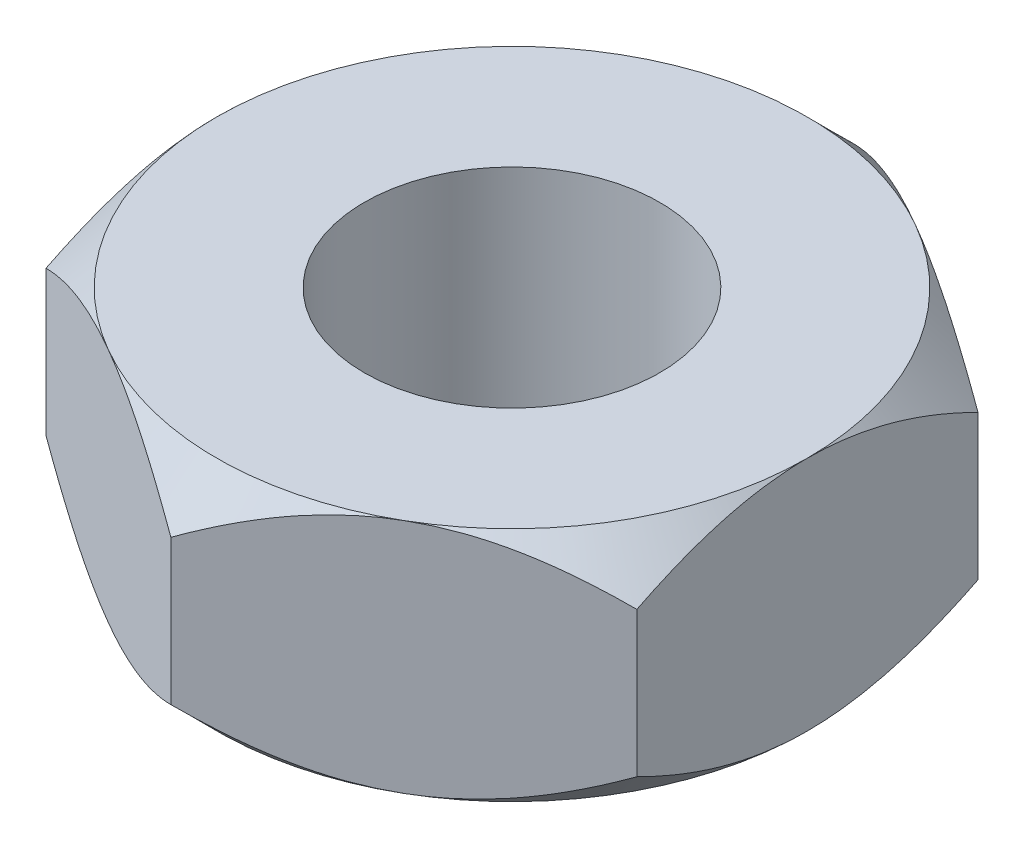
ISO-10303-21;
HEADER;
FILE_DESCRIPTION(('STEP AP214'),'2;1');
FILE_NAME('part.step','',(''),(''),'','','');
FILE_SCHEMA(('AUTOMOTIVE_DESIGN { 1 0 10303 214 1 1 1 1 }'));
ENDSEC;
DATA;
#1=APPLICATION_CONTEXT('core data for automotive mechanical design processes');
#2=APPLICATION_PROTOCOL_DEFINITION('international standard','automotive_design',2000,#1);
#3=PRODUCT_CONTEXT('',#1,'mechanical');
#4=PRODUCT('Part','Part','',(#3));
#5=PRODUCT_RELATED_PRODUCT_CATEGORY('part','',(#4));
#6=PRODUCT_DEFINITION_FORMATION('','',#4);
#7=PRODUCT_DEFINITION_CONTEXT('part definition',#1,'design');
#8=PRODUCT_DEFINITION('design','',#6,#7);
#9=PRODUCT_DEFINITION_SHAPE('','',#8);
#10=(LENGTH_UNIT() NAMED_UNIT(*) SI_UNIT(.MILLI.,.METRE.));
#11=(NAMED_UNIT(*) PLANE_ANGLE_UNIT() SI_UNIT($,.RADIAN.));
#12=(NAMED_UNIT(*) SI_UNIT($,.STERADIAN.) SOLID_ANGLE_UNIT());
#13=UNCERTAINTY_MEASURE_WITH_UNIT(LENGTH_MEASURE(1.E-05),#10,'distance_accuracy_value','');
#14=(GEOMETRIC_REPRESENTATION_CONTEXT(3) GLOBAL_UNCERTAINTY_ASSIGNED_CONTEXT((#13)) GLOBAL_UNIT_ASSIGNED_CONTEXT((#10,
#11,#12)) REPRESENTATION_CONTEXT('',''));
#15=CARTESIAN_POINT('',(0.,0.,0.));
#16=DIRECTION('',(0.,0.,1.));
#17=DIRECTION('',(1.,0.,0.));
#18=AXIS2_PLACEMENT_3D('',#15,#16,#17);
#19=CARTESIAN_POINT('',(2.5,2.,-1.44337567297407));
#20=DIRECTION('',(-0.5,0.,0.866025403784439));
#21=DIRECTION('',(0.866025403784439,0.,0.5));
#22=AXIS2_PLACEMENT_3D('',#19,#20,#21);
#23=PLANE('',#22);
#24=CARTESIAN_POINT('',(-0.000199999999999338,0.386866822929892,-2.88686681600197));
#25=CARTESIAN_POINT('',(0.0857382777877658,0.337292051302855,-2.83725032818751));
#26=CARTESIAN_POINT('',(0.173113567275755,0.290628827310634,-2.7868041812811));
#27=CARTESIAN_POINT('',(0.35128145616559,0.205189485986429,-2.6839389026696));
#28=CARTESIAN_POINT('',(0.442091000681076,0.166460908354131,-2.6315099876986));
#29=CARTESIAN_POINT('',(0.625204123126922,0.100118049845867,-2.52578957716234));
#30=CARTESIAN_POINT('',(0.717461064529342,0.0723370144789851,-2.47252500720904));
#31=CARTESIAN_POINT('',(0.904006008776287,0.0295345218587951,-2.3648232334321));
#32=CARTESIAN_POINT('',(0.998288312566284,0.0144811126194732,-2.31038931995913));
#33=CARTESIAN_POINT('',(1.16077825829185,0.000899068157610821,-2.21657570605387));
#34=CARTESIAN_POINT('',(1.22877596788015,-0.00111155481106936,-2.17731721011878));
#35=CARTESIAN_POINT('',(1.36466024116922,0.00227546313561769,-2.0988643883567));
#36=CARTESIAN_POINT('',(1.43254675755224,0.0076757012479502,-2.05967008984862));
#37=CARTESIAN_POINT('',(1.56767878823611,0.0255771343506018,-1.98165157555715));
#38=CARTESIAN_POINT('',(1.63492349975356,0.0380862729946106,-1.94282782326097));
#39=CARTESIAN_POINT('',(1.7682501008182,0.0695188479038369,-1.86585167424616));
#40=CARTESIAN_POINT('',(1.83433207909966,0.0884417924449483,-1.82769922629678));
#41=CARTESIAN_POINT('',(2.00359634669127,0.144618707356377,-1.72997445583858));
#42=CARTESIAN_POINT('',(2.10572912222289,0.186107177544317,-1.67100807039231));
#43=CARTESIAN_POINT('',(2.25590641494051,0.256145392671217,-1.58430317001562));
#44=CARTESIAN_POINT('',(2.30539653988261,0.280753598064203,-1.55573003305807));
#45=CARTESIAN_POINT('',(2.40346006383885,0.332213232663364,-1.49911303110426));
#46=CARTESIAN_POINT('',(2.45203400349693,0.359063284727484,-1.47106885396706));
#47=CARTESIAN_POINT('',(2.5002,0.386866822929892,-1.44326020292023));
#48=B_SPLINE_CURVE_WITH_KNOTS('',3,(#24,#25,#26,#27,#28,#29,#30,#31,#32,#33,#34,#35,#36,#37,#38,
#39,#40,#41,#42,#43,#44,#45,#46,#47),.UNSPECIFIED.,.F.,.F.,(4,2,2,2,2,2,2,2,2,2,2,4),(0.,
0.333012085133925,0.667964518301398,0.997597032043299,1.32639954393844,1.56169424147169,
1.79707142102083,2.03271213522171,2.26833478775651,2.64260240809533,2.82922877818864,
3.01574133749025),.UNSPECIFIED.);
#49=CARTESIAN_POINT('',(0.,0.386751345948129,-2.88675134594813));
#50=VERTEX_POINT('',#49);
#51=CARTESIAN_POINT('',(1.25,0.,-2.1650635094611));
#52=VERTEX_POINT('',#51);
#53=EDGE_CURVE('E51',#50,#52,#48,.T.);
#54=ORIENTED_EDGE('',*,*,#53,.F.);
#55=DIRECTION('',(0.,-1.,0.));
#56=VECTOR('',#55,1.);
#57=CARTESIAN_POINT('',(0.,2.,-2.88675134594813));
#58=LINE('',#57,#56);
#59=CARTESIAN_POINT('',(0.,1.61324865405187,-2.88675134594813));
#60=VERTEX_POINT('',#59);
#61=EDGE_CURVE('E277',#60,#50,#58,.T.);
#62=ORIENTED_EDGE('',*,*,#61,.F.);
#63=CARTESIAN_POINT('',(2.5002,1.61313317707011,-1.44326020292023));
#64=CARTESIAN_POINT('',(2.41426172221224,1.66270794869714,-1.49287669073469));
#65=CARTESIAN_POINT('',(2.32688643272425,1.70937117268937,-1.5433228376411));
#66=CARTESIAN_POINT('',(2.14871854383441,1.79481051401357,-1.64618811625259));
#67=CARTESIAN_POINT('',(2.05790899931892,1.83353909164587,-1.6986170312236));
#68=CARTESIAN_POINT('',(1.87479587687308,1.89988195015413,-1.80433744175986));
#69=CARTESIAN_POINT('',(1.78253893547066,1.92766298552102,-1.85760201171316));
#70=CARTESIAN_POINT('',(1.59599399122371,1.97046547814121,-1.96530378549009));
#71=CARTESIAN_POINT('',(1.50171168743372,1.98551888738053,-2.01973769896307));
#72=CARTESIAN_POINT('',(1.33922174170815,1.99910093184239,-2.11355131286833));
#73=CARTESIAN_POINT('',(1.27122403211985,2.00111155481107,-2.15280980880341));
#74=CARTESIAN_POINT('',(1.13533975883078,1.99772453686438,-2.2312626305655));
#75=CARTESIAN_POINT('',(1.06745324244776,1.99232429875205,-2.27045692907358));
#76=CARTESIAN_POINT('',(0.932321211763893,1.9744228656494,-2.34847544336505));
#77=CARTESIAN_POINT('',(0.865076500246439,1.96191372700539,-2.38729919566123));
#78=CARTESIAN_POINT('',(0.7317498991818,1.93048115209616,-2.46427534467604));
#79=CARTESIAN_POINT('',(0.665667920900342,1.91155820755505,-2.50242779262542));
#80=CARTESIAN_POINT('',(0.496403653308734,1.85538129264362,-2.60015256308362));
#81=CARTESIAN_POINT('',(0.394270877777107,1.81389282245568,-2.65911894852989));
#82=CARTESIAN_POINT('',(0.244093585059492,1.74385460732878,-2.74582384890657));
#83=CARTESIAN_POINT('',(0.194603460117391,1.7192464019358,-2.77439698586412));
#84=CARTESIAN_POINT('',(0.0965399361611543,1.66778676733664,-2.83101398781794));
#85=CARTESIAN_POINT('',(0.0479659965030732,1.64093671527252,-2.85905816495513));
#86=CARTESIAN_POINT('',(-0.000199999999998868,1.61313317707011,-2.88686681600197));
#87=B_SPLINE_CURVE_WITH_KNOTS('',3,(#63,#64,#65,#66,#67,#68,#69,#70,#71,#72,#73,#74,#75,#76,#77,
#78,#79,#80,#81,#82,#83,#84,#85,#86),.UNSPECIFIED.,.F.,.F.,(4,2,2,2,2,2,2,2,2,2,2,4),(0.,
0.333012085133924,0.667964518301397,0.997597032043299,1.32639954393844,1.56169424147169,
1.79707142102083,2.03271213522171,2.26833478775651,2.64260240809533,2.82922877818864,
3.01574133749025),.UNSPECIFIED.);
#88=CARTESIAN_POINT('',(1.25,2.,-2.1650635094611));
#89=VERTEX_POINT('',#88);
#90=EDGE_CURVE('E249',#89,#60,#87,.T.);
#91=ORIENTED_EDGE('',*,*,#90,.F.);
#92=CARTESIAN_POINT('',(2.5,1.61324865405187,-1.44337567297407));
#93=VERTEX_POINT('',#92);
#94=EDGE_CURVE('E317',#93,#89,#87,.T.);
#95=ORIENTED_EDGE('',*,*,#94,.F.);
#96=DIRECTION('',(0.,-1.,0.));
#97=VECTOR('',#96,1.);
#98=CARTESIAN_POINT('',(2.5,2.,-1.44337567297407));
#99=LINE('',#98,#97);
#100=CARTESIAN_POINT('',(2.5,0.386751345948128,-1.44337567297407));
#101=VERTEX_POINT('',#100);
#102=EDGE_CURVE('E319',#93,#101,#99,.T.);
#103=ORIENTED_EDGE('',*,*,#102,.T.);
#104=EDGE_CURVE('E136',#52,#101,#48,.T.);
#105=ORIENTED_EDGE('',*,*,#104,.F.);
#106=EDGE_LOOP('',(#54,#62,#91,#95,#103,#105));
#107=FACE_BOUND('',#106,.T.);
#108=ADVANCED_FACE('F35',(#107),#23,.F.);
#109=CARTESIAN_POINT('',(0.,2.,-2.88675134594813));
#110=DIRECTION('',(0.5,0.,0.866025403784439));
#111=DIRECTION('',(0.866025403784439,0.,-0.5));
#112=AXIS2_PLACEMENT_3D('',#109,#110,#111);
#113=PLANE('',#112);
#114=CARTESIAN_POINT('',(-2.5002,0.386866822929892,-1.44326020292023));
#115=CARTESIAN_POINT('',(-2.41426172221224,0.337292051302855,-1.49287669073469));
#116=CARTESIAN_POINT('',(-2.32688643272425,0.290628827310634,-1.5433228376411));
#117=CARTESIAN_POINT('',(-2.14871854383441,0.205189485986429,-1.64618811625259));
#118=CARTESIAN_POINT('',(-2.05790899931893,0.16646090835413,-1.6986170312236));
#119=CARTESIAN_POINT('',(-1.87479587687308,0.100118049845867,-1.80433744175986));
#120=CARTESIAN_POINT('',(-1.78253893547066,0.0723370144789846,-1.85760201171316));
#121=CARTESIAN_POINT('',(-1.59599399122371,0.0295345218587945,-1.96530378549009));
#122=CARTESIAN_POINT('',(-1.50171168743372,0.0144811126194725,-2.01973769896307));
#123=CARTESIAN_POINT('',(-1.33922174170815,0.000899068157610402,-2.11355131286833));
#124=CARTESIAN_POINT('',(-1.27122403211985,-0.00111155481106953,-2.15280980880341));
#125=CARTESIAN_POINT('',(-1.13533975883078,0.00227546313561764,-2.23126263056549));
#126=CARTESIAN_POINT('',(-1.06745324244776,0.00767570124795,-2.27045692907358));
#127=CARTESIAN_POINT('',(-0.932321211763893,0.0255771343506014,-2.34847544336505));
#128=CARTESIAN_POINT('',(-0.865076500246439,0.03808627299461,-2.38729919566123));
#129=CARTESIAN_POINT('',(-0.7317498991818,0.0695188479038363,-2.46427534467604));
#130=CARTESIAN_POINT('',(-0.665667920900342,0.0884417924449479,-2.50242779262542));
#131=CARTESIAN_POINT('',(-0.496403653308734,0.144618707356377,-2.60015256308362));
#132=CARTESIAN_POINT('',(-0.394270877777106,0.186107177544317,-2.65911894852989));
#133=CARTESIAN_POINT('',(-0.24409358505949,0.256145392671217,-2.74582384890657));
#134=CARTESIAN_POINT('',(-0.19460346011739,0.280753598064203,-2.77439698586412));
#135=CARTESIAN_POINT('',(-0.0965399361611525,0.332213232663364,-2.83101398781794));
#136=CARTESIAN_POINT('',(-0.0479659965030714,0.359063284727485,-2.85905816495513));
#137=CARTESIAN_POINT('',(0.000200000000000784,0.386866822929893,-2.88686681600197));
#138=B_SPLINE_CURVE_WITH_KNOTS('',3,(#114,#115,#116,#117,#118,#119,#120,#121,#122,#123,#124,
#125,#126,#127,#128,#129,#130,#131,#132,#133,#134,#135,#136,#137),.UNSPECIFIED.,.F.,.F.,(4,2,2,
2,2,2,2,2,2,2,2,4),(0.,0.333012085133925,0.667964518301398,0.9975970320433,1.32639954393844,
1.56169424147169,1.79707142102083,2.03271213522171,2.26833478775651,2.64260240809533,
2.82922877818864,3.01574133749025),.UNSPECIFIED.);
#139=CARTESIAN_POINT('',(-2.5,0.386751345948128,-1.44337567297407));
#140=VERTEX_POINT('',#139);
#141=CARTESIAN_POINT('',(-1.25,0.,-2.1650635094611));
#142=VERTEX_POINT('',#141);
#143=EDGE_CURVE('E59',#140,#142,#138,.T.);
#144=ORIENTED_EDGE('',*,*,#143,.F.);
#145=DIRECTION('',(0.,-1.,0.));
#146=VECTOR('',#145,1.);
#147=CARTESIAN_POINT('',(-2.5,2.,-1.44337567297407));
#148=LINE('',#147,#146);
#149=CARTESIAN_POINT('',(-2.5,1.61324865405187,-1.44337567297407));
#150=VERTEX_POINT('',#149);
#151=EDGE_CURVE('E270',#150,#140,#148,.T.);
#152=ORIENTED_EDGE('',*,*,#151,.F.);
#153=CARTESIAN_POINT('',(0.000200000000000751,1.61313317707011,-2.88686681600197));
#154=CARTESIAN_POINT('',(-0.0857382777877642,1.66270794869714,-2.83725032818751));
#155=CARTESIAN_POINT('',(-0.173113567275753,1.70937117268937,-2.7868041812811));
#156=CARTESIAN_POINT('',(-0.351281456165588,1.79481051401357,-2.6839389026696));
#157=CARTESIAN_POINT('',(-0.442091000681074,1.83353909164587,-2.6315099876986));
#158=CARTESIAN_POINT('',(-0.625204123126921,1.89988195015413,-2.52578957716234));
#159=CARTESIAN_POINT('',(-0.71746106452934,1.92766298552102,-2.47252500720904));
#160=CARTESIAN_POINT('',(-0.904006008776286,1.9704654781412,-2.3648232334321));
#161=CARTESIAN_POINT('',(-0.998288312566283,1.98551888738053,-2.31038931995913));
#162=CARTESIAN_POINT('',(-1.16077825829185,1.99910093184239,-2.21657570605387));
#163=CARTESIAN_POINT('',(-1.22877596788015,2.00111155481107,-2.17731721011878));
#164=CARTESIAN_POINT('',(-1.36466024116922,1.99772453686438,-2.0988643883567));
#165=CARTESIAN_POINT('',(-1.43254675755224,1.99232429875205,-2.05967008984862));
#166=CARTESIAN_POINT('',(-1.56767878823611,1.9744228656494,-1.98165157555715));
#167=CARTESIAN_POINT('',(-1.63492349975356,1.96191372700539,-1.94282782326097));
#168=CARTESIAN_POINT('',(-1.7682501008182,1.93048115209616,-1.86585167424616));
#169=CARTESIAN_POINT('',(-1.83433207909966,1.91155820755505,-1.82769922629678));
#170=CARTESIAN_POINT('',(-2.00359634669127,1.85538129264362,-1.72997445583858));
#171=CARTESIAN_POINT('',(-2.10572912222289,1.81389282245568,-1.67100807039231));
#172=CARTESIAN_POINT('',(-2.25590641494051,1.74385460732878,-1.58430317001562));
#173=CARTESIAN_POINT('',(-2.30539653988261,1.7192464019358,-1.55573003305807));
#174=CARTESIAN_POINT('',(-2.40346006383885,1.66778676733664,-1.49911303110426));
#175=CARTESIAN_POINT('',(-2.45203400349693,1.64093671527252,-1.47106885396706));
#176=CARTESIAN_POINT('',(-2.5002,1.61313317707011,-1.44326020292023));
#177=B_SPLINE_CURVE_WITH_KNOTS('',3,(#153,#154,#155,#156,#157,#158,#159,#160,#161,#162,#163,
#164,#165,#166,#167,#168,#169,#170,#171,#172,#173,#174,#175,#176),.UNSPECIFIED.,.F.,.F.,(4,2,2,
2,2,2,2,2,2,2,2,4),(0.,0.333012085133925,0.667964518301398,0.9975970320433,1.32639954393844,
1.56169424147169,1.79707142102083,2.03271213522171,2.26833478775651,2.64260240809533,
2.82922877818864,3.01574133749025),.UNSPECIFIED.);
#178=CARTESIAN_POINT('',(-1.25,2.,-2.1650635094611));
#179=VERTEX_POINT('',#178);
#180=EDGE_CURVE('E242',#179,#150,#177,.T.);
#181=ORIENTED_EDGE('',*,*,#180,.F.);
#182=EDGE_CURVE('E248',#60,#179,#177,.T.);
#183=ORIENTED_EDGE('',*,*,#182,.F.);
#184=ORIENTED_EDGE('',*,*,#61,.T.);
#185=EDGE_CURVE('E159',#142,#50,#138,.T.);
#186=ORIENTED_EDGE('',*,*,#185,.F.);
#187=EDGE_LOOP('',(#144,#152,#181,#183,#184,#186));
#188=FACE_BOUND('',#187,.T.);
#189=ADVANCED_FACE('F255',(#188),#113,.F.);
#190=CARTESIAN_POINT('',(-2.5,2.,-1.44337567297407));
#191=DIRECTION('',(1.,0.,0.));
#192=DIRECTION('',(0.,0.,-1.));
#193=AXIS2_PLACEMENT_3D('',#190,#191,#192);
#194=PLANE('',#193);
#195=CARTESIAN_POINT('',(-2.5,1.61274360316228,-3.26567909405567));
#196=CARTESIAN_POINT('',(-2.5,1.55080668033765,-3.1876597357196));
#197=CARTESIAN_POINT('',(-2.5,1.489354125676,-3.10925011326456));
#198=CARTESIAN_POINT('',(-2.5,1.36764674853936,-2.9514810930779));
#199=CARTESIAN_POINT('',(-2.5,1.30739218330598,-2.87212149709823));
#200=CARTESIAN_POINT('',(-2.5,1.1878844213843,-2.71170975539801));
#201=CARTESIAN_POINT('',(-2.5,1.12864229836218,-2.63064933443875));
#202=CARTESIAN_POINT('',(-2.5,1.01197598444938,-2.46723546824709));
#203=CARTESIAN_POINT('',(-2.5,0.954551672562325,-2.38488210962281));
#204=CARTESIAN_POINT('',(-2.5,0.837693856171789,-2.21235850361717));
#205=CARTESIAN_POINT('',(-2.5,0.778436853987643,-2.12206811516737));
#206=CARTESIAN_POINT('',(-2.5,0.663239415622615,-1.93935936342298));
#207=CARTESIAN_POINT('',(-2.5,0.607299596192161,-1.84694060881695));
#208=CARTESIAN_POINT('',(-2.5,0.499897293966414,-1.65988899862695));
#209=CARTESIAN_POINT('',(-2.5,0.448421799255687,-1.56526367289385));
#210=CARTESIAN_POINT('',(-2.5,0.351101364408176,-1.37318301361869));
#211=CARTESIAN_POINT('',(-2.5,0.305253588160801,-1.27572913640846));
#212=CARTESIAN_POINT('',(-2.5,0.22628725437335,-1.09029639896578));
#213=CARTESIAN_POINT('',(-2.5,0.192290940023054,-1.00269511248596));
#214=CARTESIAN_POINT('',(-2.5,0.131300227675576,-0.825041993603072));
#215=CARTESIAN_POINT('',(-2.5,0.104306230617393,-0.73499002120457));
#216=CARTESIAN_POINT('',(-2.5,0.0593415490779055,-0.554685314756036));
#217=CARTESIAN_POINT('',(-2.5,0.041188779393613,-0.464478815244774));
#218=CARTESIAN_POINT('',(-2.5,0.0143250807741684,-0.28266267034721));
#219=CARTESIAN_POINT('',(-2.5,0.0056114227313203,-0.191053438302298));
#220=CARTESIAN_POINT('',(-2.5,-0.00145424133300716,-0.0129543264737005));
#221=CARTESIAN_POINT('',(-2.5,-0.000397976929626955,0.0735120365543203));
#222=CARTESIAN_POINT('',(-2.5,0.0105883536211225,0.245874267573355));
#223=CARTESIAN_POINT('',(-2.5,0.0205191017096203,0.331770091211445));
#224=CARTESIAN_POINT('',(-2.5,0.0488246568319909,0.503842956116674));
#225=CARTESIAN_POINT('',(-2.5,0.0673591293116641,0.589993280937961));
#226=CARTESIAN_POINT('',(-2.5,0.111771145214338,0.760336458455045));
#227=CARTESIAN_POINT('',(-2.5,0.137648674951632,0.844529314798779));
#228=CARTESIAN_POINT('',(-2.5,0.224707317172841,1.09483730163166));
#229=CARTESIAN_POINT('',(-2.5,0.295134503606764,1.25774193664881));
#230=CARTESIAN_POINT('',(-2.5,0.412698798002815,1.49619216550169));
#231=CARTESIAN_POINT('',(-2.5,0.453962999838349,1.5748333423118));
#232=CARTESIAN_POINT('',(-2.5,0.539715609648841,1.73034188339433));
#233=CARTESIAN_POINT('',(-2.5,0.584203467228031,1.80720954752923));
#234=CARTESIAN_POINT('',(-2.5,0.673501697868623,1.95561959718083));
#235=CARTESIAN_POINT('',(-2.5,0.718187820400806,2.02723758587862));
#236=CARTESIAN_POINT('',(-2.5,0.809481081710538,2.16924442838932));
#237=CARTESIAN_POINT('',(-2.5,0.85608836195537,2.23963319114109));
#238=CARTESIAN_POINT('',(-2.5,0.950507988645338,2.37878146847468));
#239=CARTESIAN_POINT('',(-2.5,0.998307883594118,2.44754946719262));
#240=CARTESIAN_POINT('',(-2.5,1.09520282156358,2.58413952769418));
#241=CARTESIAN_POINT('',(-2.5,1.14429750444471,2.65196184465657));
#242=CARTESIAN_POINT('',(-2.5,1.19392283698374,2.71938704961064));
#243=B_SPLINE_CURVE_WITH_KNOTS('',3,(#195,#196,#197,#198,#199,#200,#201,#202,#203,#204,#205,
#206,#207,#208,#209,#210,#211,#212,#213,#214,#215,#216,#217,#218,#219,#220,#221,#222,#223,#224,
#225,#226,#227,#228,#229,#230,#231,#232,#233,#234,#235,#236,#237,#238,#239,#240,#241,#242),
.UNSPECIFIED.,.F.,.F.,(4,2,2,2,2,2,2,2,2,2,2,2,2,2,2,2,2,2,2,2,2,2,2,4),(0.,0.29885056163874,
0.597764616457264,0.898947760907934,1.20011081579959,1.52405067075365,1.84805056690858,
2.17107194014598,2.49392985127604,2.77559391837559,3.05727410945089,3.33287803908302,
3.60840226272653,3.86735363281682,4.1263249031945,4.39030698492101,4.65428857465111,
5.18509165483082,5.45149656772086,5.71785610225249,5.97107149106172,6.22430555918607,
6.47553611643667,6.72669751703712),.UNSPECIFIED.);
#244=CARTESIAN_POINT('',(-2.5,0.386751345948128,1.44337567297406));
#245=VERTEX_POINT('',#244);
#246=CARTESIAN_POINT('',(-2.5,0.,0.));
#247=VERTEX_POINT('',#246);
#248=EDGE_CURVE('E346',#245,#247,#243,.F.);
#249=ORIENTED_EDGE('',*,*,#248,.F.);
#250=DIRECTION('',(0.,-1.,0.));
#251=VECTOR('',#250,1.);
#252=CARTESIAN_POINT('',(-2.5,2.,1.44337567297406));
#253=LINE('',#252,#251);
#254=CARTESIAN_POINT('',(-2.5,1.61324865405187,1.44337567297406));
#255=VERTEX_POINT('',#254);
#256=EDGE_CURVE('E278',#255,#245,#253,.T.);
#257=ORIENTED_EDGE('',*,*,#256,.F.);
#258=CARTESIAN_POINT('',(-2.5,0.387256396837723,-3.26567909405567));
#259=CARTESIAN_POINT('',(-2.5,0.449193319662348,-3.1876597357196));
#260=CARTESIAN_POINT('',(-2.5,0.510645874324,-3.10925011326456));
#261=CARTESIAN_POINT('',(-2.5,0.632353251460638,-2.9514810930779));
#262=CARTESIAN_POINT('',(-2.5,0.692607816694021,-2.87212149709823));
#263=CARTESIAN_POINT('',(-2.5,0.812115578615702,-2.71170975539801));
#264=CARTESIAN_POINT('',(-2.5,0.871357701637818,-2.63064933443875));
#265=CARTESIAN_POINT('',(-2.5,0.988024015550616,-2.46723546824709));
#266=CARTESIAN_POINT('',(-2.5,1.04544832743768,-2.38488210962281));
#267=CARTESIAN_POINT('',(-2.5,1.16230614382821,-2.21235850361717));
#268=CARTESIAN_POINT('',(-2.5,1.22156314601236,-2.12206811516737));
#269=CARTESIAN_POINT('',(-2.5,1.33676058437739,-1.93935936342298));
#270=CARTESIAN_POINT('',(-2.5,1.39270040380784,-1.84694060881695));
#271=CARTESIAN_POINT('',(-2.5,1.50010270603359,-1.65988899862695));
#272=CARTESIAN_POINT('',(-2.5,1.55157820074431,-1.56526367289385));
#273=CARTESIAN_POINT('',(-2.5,1.64889863559182,-1.37318301361869));
#274=CARTESIAN_POINT('',(-2.5,1.6947464118392,-1.27572913640846));
#275=CARTESIAN_POINT('',(-2.5,1.77371274562665,-1.09029639896578));
#276=CARTESIAN_POINT('',(-2.5,1.80770905997695,-1.00269511248596));
#277=CARTESIAN_POINT('',(-2.5,1.86869977232442,-0.825041993603072));
#278=CARTESIAN_POINT('',(-2.5,1.89569376938261,-0.73499002120457));
#279=CARTESIAN_POINT('',(-2.5,1.94065845092209,-0.554685314756036));
#280=CARTESIAN_POINT('',(-2.5,1.95881122060639,-0.464478815244774));
#281=CARTESIAN_POINT('',(-2.5,1.98567491922583,-0.282662670347209));
#282=CARTESIAN_POINT('',(-2.5,1.99438857726868,-0.191053438302298));
#283=CARTESIAN_POINT('',(-2.5,2.00145424133301,-0.0129543264737002));
#284=CARTESIAN_POINT('',(-2.5,2.00039797692963,0.0735120365543206));
#285=CARTESIAN_POINT('',(-2.5,1.98941164637888,0.245874267573356));
#286=CARTESIAN_POINT('',(-2.5,1.97948089829038,0.331770091211446));
#287=CARTESIAN_POINT('',(-2.5,1.95117534316801,0.503842956116675));
#288=CARTESIAN_POINT('',(-2.5,1.93264087068834,0.589993280937961));
#289=CARTESIAN_POINT('',(-2.5,1.88822885478566,0.760336458455045));
#290=CARTESIAN_POINT('',(-2.5,1.86235132504837,0.844529314798779));
#291=CARTESIAN_POINT('',(-2.5,1.77529268282716,1.09483730163166));
#292=CARTESIAN_POINT('',(-2.5,1.70486549639324,1.25774193664881));
#293=CARTESIAN_POINT('',(-2.5,1.58730120199719,1.49619216550169));
#294=CARTESIAN_POINT('',(-2.5,1.54603700016165,1.5748333423118));
#295=CARTESIAN_POINT('',(-2.5,1.46028439035116,1.73034188339433));
#296=CARTESIAN_POINT('',(-2.5,1.41579653277197,1.80720954752923));
#297=CARTESIAN_POINT('',(-2.5,1.32649830213138,1.95561959718083));
#298=CARTESIAN_POINT('',(-2.5,1.28181217959919,2.02723758587862));
#299=CARTESIAN_POINT('',(-2.5,1.19051891828946,2.16924442838932));
#300=CARTESIAN_POINT('',(-2.5,1.14391163804463,2.23963319114109));
#301=CARTESIAN_POINT('',(-2.5,1.04949201135466,2.37878146847468));
#302=CARTESIAN_POINT('',(-2.5,1.00169211640588,2.44754946719262));
#303=CARTESIAN_POINT('',(-2.5,0.904797178436418,2.58413952769418));
#304=CARTESIAN_POINT('',(-2.5,0.855702495555293,2.65196184465657));
#305=CARTESIAN_POINT('',(-2.5,0.806077163016257,2.71938704961064));
#306=B_SPLINE_CURVE_WITH_KNOTS('',3,(#258,#259,#260,#261,#262,#263,#264,#265,#266,#267,#268,
#269,#270,#271,#272,#273,#274,#275,#276,#277,#278,#279,#280,#281,#282,#283,#284,#285,#286,#287,
#288,#289,#290,#291,#292,#293,#294,#295,#296,#297,#298,#299,#300,#301,#302,#303,#304,#305),
.UNSPECIFIED.,.F.,.F.,(4,2,2,2,2,2,2,2,2,2,2,2,2,2,2,2,2,2,2,2,2,2,2,4),(0.,0.29885056163874,
0.597764616457264,0.898947760907935,1.20011081579959,1.52405067075365,1.84805056690858,
2.17107194014598,2.49392985127604,2.77559391837559,3.05727410945089,3.33287803908303,
3.60840226272653,3.86735363281682,4.12632490319451,4.39030698492101,4.65428857465111,
5.18509165483082,5.45149656772086,5.71785610225249,5.97107149106172,6.22430555918608,
6.47553611643667,6.72669751703712),.UNSPECIFIED.);
#307=CARTESIAN_POINT('',(-2.5,2.,0.));
#308=VERTEX_POINT('',#307);
#309=EDGE_CURVE('E235',#308,#255,#306,.T.);
#310=ORIENTED_EDGE('',*,*,#309,.F.);
#311=EDGE_CURVE('E241',#150,#308,#306,.T.);
#312=ORIENTED_EDGE('',*,*,#311,.F.);
#313=ORIENTED_EDGE('',*,*,#151,.T.);
#314=EDGE_CURVE('E194',#247,#140,#243,.F.);
#315=ORIENTED_EDGE('',*,*,#314,.F.);
#316=EDGE_LOOP('',(#249,#257,#310,#312,#313,#315));
#317=FACE_BOUND('',#316,.T.);
#318=ADVANCED_FACE('F216',(#317),#194,.F.);
#319=CARTESIAN_POINT('',(-2.5,2.,1.44337567297406));
#320=DIRECTION('',(0.5,0.,-0.866025403784439));
#321=DIRECTION('',(-0.866025403784438,0.,-0.5));
#322=AXIS2_PLACEMENT_3D('',#319,#320,#321);
#323=PLANE('',#322);
#324=CARTESIAN_POINT('',(0.000199999999999947,0.386866822929892,2.88686681600197));
#325=CARTESIAN_POINT('',(-0.0857382777877645,0.337292051302855,2.83725032818751));
#326=CARTESIAN_POINT('',(-0.173113567275753,0.290628827310633,2.7868041812811));
#327=CARTESIAN_POINT('',(-0.351281456165589,0.205189485986429,2.6839389026696));
#328=CARTESIAN_POINT('',(-0.442091000681075,0.16646090835413,2.6315099876986));
#329=CARTESIAN_POINT('',(-0.625204123126922,0.100118049845867,2.52578957716234));
#330=CARTESIAN_POINT('',(-0.717461064529341,0.0723370144789846,2.47252500720904));
#331=CARTESIAN_POINT('',(-0.904006008776287,0.0295345218587941,2.3648232334321));
#332=CARTESIAN_POINT('',(-0.998288312566284,0.0144811126194721,2.31038931995913));
#333=CARTESIAN_POINT('',(-1.16077825829185,0.00089906815760981,2.21657570605387));
#334=CARTESIAN_POINT('',(-1.22877596788015,-0.00111155481107021,2.17731721011878));
#335=CARTESIAN_POINT('',(-1.36466024116922,0.00227546313561681,2.0988643883567));
#336=CARTESIAN_POINT('',(-1.43254675755224,0.00767570124794913,2.05967008984862));
#337=CARTESIAN_POINT('',(-1.56767878823611,0.0255771343506007,1.98165157555715));
#338=CARTESIAN_POINT('',(-1.63492349975356,0.0380862729946096,1.94282782326097));
#339=CARTESIAN_POINT('',(-1.7682501008182,0.069518847903836,1.86585167424616));
#340=CARTESIAN_POINT('',(-1.83433207909966,0.0884417924449473,1.82769922629678));
#341=CARTESIAN_POINT('',(-2.00359634669127,0.144618707356376,1.72997445583858));
#342=CARTESIAN_POINT('',(-2.10572912222289,0.186107177544316,1.67100807039231));
#343=CARTESIAN_POINT('',(-2.25590641494051,0.256145392671216,1.58430317001562));
#344=CARTESIAN_POINT('',(-2.30539653988261,0.280753598064202,1.55573003305807));
#345=CARTESIAN_POINT('',(-2.40346006383885,0.332213232663363,1.49911303110426));
#346=CARTESIAN_POINT('',(-2.45203400349693,0.359063284727484,1.47106885396706));
#347=CARTESIAN_POINT('',(-2.5002,0.386866822929892,1.44326020292023));
#348=B_SPLINE_CURVE_WITH_KNOTS('',3,(#324,#325,#326,#327,#328,#329,#330,#331,#332,#333,#334,
#335,#336,#337,#338,#339,#340,#341,#342,#343,#344,#345,#346,#347),.UNSPECIFIED.,.F.,.F.,(4,2,2,
2,2,2,2,2,2,2,2,4),(0.,0.333012085133925,0.667964518301398,0.9975970320433,1.32639954393844,
1.56169424147169,1.79707142102083,2.03271213522171,2.26833478775651,2.64260240809533,
2.82922877818864,3.01574133749025),.UNSPECIFIED.);
#349=CARTESIAN_POINT('',(0.,0.386751345948128,2.88675134594813));
#350=VERTEX_POINT('',#349);
#351=CARTESIAN_POINT('',(-1.25,0.,2.1650635094611));
#352=VERTEX_POINT('',#351);
#353=EDGE_CURVE('E145',#350,#352,#348,.T.);
#354=ORIENTED_EDGE('',*,*,#353,.F.);
#355=DIRECTION('',(0.,-1.,0.));
#356=VECTOR('',#355,1.);
#357=CARTESIAN_POINT('',(0.,2.,2.88675134594813));
#358=LINE('',#357,#356);
#359=CARTESIAN_POINT('',(0.,1.61324865405187,2.88675134594813));
#360=VERTEX_POINT('',#359);
#361=EDGE_CURVE('E158',#360,#350,#358,.T.);
#362=ORIENTED_EDGE('',*,*,#361,.F.);
#363=CARTESIAN_POINT('',(-2.5002,1.61313317707011,1.44326020292023));
#364=CARTESIAN_POINT('',(-2.41426172221224,1.66270794869715,1.49287669073469));
#365=CARTESIAN_POINT('',(-2.32688643272425,1.70937117268937,1.5433228376411));
#366=CARTESIAN_POINT('',(-2.14871854383441,1.79481051401357,1.64618811625259));
#367=CARTESIAN_POINT('',(-2.05790899931893,1.83353909164587,1.69861703122359));
#368=CARTESIAN_POINT('',(-1.87479587687308,1.89988195015413,1.80433744175986));
#369=CARTESIAN_POINT('',(-1.78253893547066,1.92766298552102,1.85760201171316));
#370=CARTESIAN_POINT('',(-1.59599399122371,1.97046547814121,1.96530378549009));
#371=CARTESIAN_POINT('',(-1.50171168743372,1.98551888738053,2.01973769896307));
#372=CARTESIAN_POINT('',(-1.33922174170815,1.99910093184239,2.11355131286833));
#373=CARTESIAN_POINT('',(-1.27122403211985,2.00111155481107,2.15280980880341));
#374=CARTESIAN_POINT('',(-1.13533975883078,1.99772453686438,2.23126263056549));
#375=CARTESIAN_POINT('',(-1.06745324244776,1.99232429875205,2.27045692907358));
#376=CARTESIAN_POINT('',(-0.932321211763894,1.9744228656494,2.34847544336505));
#377=CARTESIAN_POINT('',(-0.865076500246439,1.96191372700539,2.38729919566123));
#378=CARTESIAN_POINT('',(-0.7317498991818,1.93048115209616,2.46427534467604));
#379=CARTESIAN_POINT('',(-0.665667920900342,1.91155820755505,2.50242779262542));
#380=CARTESIAN_POINT('',(-0.496403653308735,1.85538129264362,2.60015256308362));
#381=CARTESIAN_POINT('',(-0.394270877777107,1.81389282245568,2.65911894852989));
#382=CARTESIAN_POINT('',(-0.244093585059491,1.74385460732878,2.74582384890657));
#383=CARTESIAN_POINT('',(-0.19460346011739,1.7192464019358,2.77439698586412));
#384=CARTESIAN_POINT('',(-0.0965399361611529,1.66778676733664,2.83101398781794));
#385=CARTESIAN_POINT('',(-0.0479659965030718,1.64093671527252,2.85905816495513));
#386=CARTESIAN_POINT('',(0.000200000000000272,1.61313317707011,2.88686681600197));
#387=B_SPLINE_CURVE_WITH_KNOTS('',3,(#363,#364,#365,#366,#367,#368,#369,#370,#371,#372,#373,
#374,#375,#376,#377,#378,#379,#380,#381,#382,#383,#384,#385,#386),.UNSPECIFIED.,.F.,.F.,(4,2,2,
2,2,2,2,2,2,2,2,4),(0.,0.333012085133925,0.667964518301398,0.9975970320433,1.32639954393844,
1.56169424147169,1.79707142102083,2.03271213522171,2.26833478775651,2.64260240809533,
2.82922877818864,3.01574133749025),.UNSPECIFIED.);
#388=CARTESIAN_POINT('',(-1.25,2.,2.1650635094611));
#389=VERTEX_POINT('',#388);
#390=EDGE_CURVE('E221',#389,#360,#387,.T.);
#391=ORIENTED_EDGE('',*,*,#390,.F.);
#392=EDGE_CURVE('E228',#255,#389,#387,.T.);
#393=ORIENTED_EDGE('',*,*,#392,.F.);
#394=ORIENTED_EDGE('',*,*,#256,.T.);
#395=EDGE_CURVE('E161',#352,#245,#348,.T.);
#396=ORIENTED_EDGE('',*,*,#395,.F.);
#397=EDGE_LOOP('',(#354,#362,#391,#393,#394,#396));
#398=FACE_BOUND('',#397,.T.);
#399=ADVANCED_FACE('F213',(#398),#323,.F.);
#400=CARTESIAN_POINT('',(0.,2.,2.88675134594813));
#401=DIRECTION('',(-0.5,0.,-0.866025403784439));
#402=DIRECTION('',(-0.866025403784439,0.,0.5));
#403=AXIS2_PLACEMENT_3D('',#400,#401,#402);
#404=PLANE('',#403);
#405=CARTESIAN_POINT('',(2.5002,0.386866822929892,1.44326020292023));
#406=CARTESIAN_POINT('',(2.41426172221223,0.337292051302855,1.49287669073469));
#407=CARTESIAN_POINT('',(2.32688643272425,0.290628827310633,1.5433228376411));
#408=CARTESIAN_POINT('',(2.14871854383441,0.205189485986429,1.64618811625259));
#409=CARTESIAN_POINT('',(2.05790899931893,0.166460908354131,1.6986170312236));
#410=CARTESIAN_POINT('',(1.87479587687308,0.100118049845867,1.80433744175986));
#411=CARTESIAN_POINT('',(1.78253893547066,0.0723370144789847,1.85760201171316));
#412=CARTESIAN_POINT('',(1.59599399122371,0.0295345218587946,1.96530378549009));
#413=CARTESIAN_POINT('',(1.50171168743372,0.014481112619473,2.01973769896307));
#414=CARTESIAN_POINT('',(1.33922174170815,0.000899068157610807,2.11355131286833));
#415=CARTESIAN_POINT('',(1.27122403211985,-0.00111155481106932,2.15280980880341));
#416=CARTESIAN_POINT('',(1.13533975883078,0.00227546313561744,2.23126263056549));
#417=CARTESIAN_POINT('',(1.06745324244776,0.00767570124794961,2.27045692907358));
#418=CARTESIAN_POINT('',(0.932321211763894,0.0255771343506011,2.34847544336505));
#419=CARTESIAN_POINT('',(0.86507650024644,0.03808627299461,2.38729919566123));
#420=CARTESIAN_POINT('',(0.731749899181801,0.0695188479038364,2.46427534467604));
#421=CARTESIAN_POINT('',(0.665667920900343,0.0884417924449478,2.50242779262542));
#422=CARTESIAN_POINT('',(0.496403653308735,0.144618707356376,2.60015256308362));
#423=CARTESIAN_POINT('',(0.394270877777107,0.186107177544316,2.65911894852989));
#424=CARTESIAN_POINT('',(0.244093585059491,0.256145392671217,2.74582384890657));
#425=CARTESIAN_POINT('',(0.194603460117391,0.280753598064202,2.77439698586412));
#426=CARTESIAN_POINT('',(0.0965399361611536,0.332213232663364,2.83101398781794));
#427=CARTESIAN_POINT('',(0.0479659965030723,0.359063284727484,2.85905816495513));
#428=CARTESIAN_POINT('',(-0.000199999999999848,0.386866822929892,2.88686681600197));
#429=B_SPLINE_CURVE_WITH_KNOTS('',3,(#405,#406,#407,#408,#409,#410,#411,#412,#413,#414,#415,
#416,#417,#418,#419,#420,#421,#422,#423,#424,#425,#426,#427,#428),.UNSPECIFIED.,.F.,.F.,(4,2,2,
2,2,2,2,2,2,2,2,4),(0.,0.333012085133923,0.667964518301396,0.997597032043298,1.32639954393844,
1.56169424147168,1.79707142102083,2.03271213522171,2.2683347877565,2.64260240809533,
2.82922877818864,3.01574133749025),.UNSPECIFIED.);
#430=CARTESIAN_POINT('',(2.5,0.386751345948128,1.44337567297407));
#431=VERTEX_POINT('',#430);
#432=CARTESIAN_POINT('',(1.25,0.,2.1650635094611));
#433=VERTEX_POINT('',#432);
#434=EDGE_CURVE('E125',#431,#433,#429,.T.);
#435=ORIENTED_EDGE('',*,*,#434,.F.);
#436=DIRECTION('',(0.,-1.,0.));
#437=VECTOR('',#436,1.);
#438=CARTESIAN_POINT('',(2.5,2.,1.44337567297407));
#439=LINE('',#438,#437);
#440=CARTESIAN_POINT('',(2.5,1.61324865405187,1.44337567297407));
#441=VERTEX_POINT('',#440);
#442=EDGE_CURVE('E324',#441,#431,#439,.T.);
#443=ORIENTED_EDGE('',*,*,#442,.F.);
#444=CARTESIAN_POINT('',(-0.000200000000000088,1.61313317707011,2.88686681600197));
#445=CARTESIAN_POINT('',(0.0857382777877648,1.66270794869714,2.83725032818751));
#446=CARTESIAN_POINT('',(0.173113567275753,1.70937117268937,2.7868041812811));
#447=CARTESIAN_POINT('',(0.351281456165588,1.79481051401357,2.6839389026696));
#448=CARTESIAN_POINT('',(0.442091000681074,1.83353909164587,2.6315099876986));
#449=CARTESIAN_POINT('',(0.625204123126921,1.89988195015413,2.52578957716234));
#450=CARTESIAN_POINT('',(0.71746106452934,1.92766298552101,2.47252500720904));
#451=CARTESIAN_POINT('',(0.904006008776286,1.97046547814121,2.3648232334321));
#452=CARTESIAN_POINT('',(0.998288312566283,1.98551888738053,2.31038931995913));
#453=CARTESIAN_POINT('',(1.16077825829185,1.99910093184239,2.21657570605387));
#454=CARTESIAN_POINT('',(1.22877596788015,2.00111155481107,2.17731721011878));
#455=CARTESIAN_POINT('',(1.36466024116922,1.99772453686438,2.0988643883567));
#456=CARTESIAN_POINT('',(1.43254675755224,1.99232429875205,2.05967008984862));
#457=CARTESIAN_POINT('',(1.56767878823611,1.9744228656494,1.98165157555715));
#458=CARTESIAN_POINT('',(1.63492349975356,1.96191372700539,1.94282782326097));
#459=CARTESIAN_POINT('',(1.7682501008182,1.93048115209616,1.86585167424616));
#460=CARTESIAN_POINT('',(1.83433207909966,1.91155820755505,1.82769922629678));
#461=CARTESIAN_POINT('',(2.00359634669126,1.85538129264362,1.72997445583858));
#462=CARTESIAN_POINT('',(2.10572912222289,1.81389282245568,1.67100807039231));
#463=CARTESIAN_POINT('',(2.25590641494051,1.74385460732878,1.58430317001562));
#464=CARTESIAN_POINT('',(2.30539653988261,1.7192464019358,1.55573003305807));
#465=CARTESIAN_POINT('',(2.40346006383885,1.66778676733664,1.49911303110426));
#466=CARTESIAN_POINT('',(2.45203400349693,1.64093671527252,1.47106885396706));
#467=CARTESIAN_POINT('',(2.5002,1.61313317707011,1.44326020292023));
#468=B_SPLINE_CURVE_WITH_KNOTS('',3,(#444,#445,#446,#447,#448,#449,#450,#451,#452,#453,#454,
#455,#456,#457,#458,#459,#460,#461,#462,#463,#464,#465,#466,#467),.UNSPECIFIED.,.F.,.F.,(4,2,2,
2,2,2,2,2,2,2,2,4),(0.,0.333012085133924,0.667964518301397,0.997597032043299,1.32639954393844,
1.56169424147169,1.79707142102083,2.03271213522171,2.26833478775651,2.64260240809533,
2.82922877818864,3.01574133749025),.UNSPECIFIED.);
#469=CARTESIAN_POINT('',(1.25,2.,2.1650635094611));
#470=VERTEX_POINT('',#469);
#471=EDGE_CURVE('E230',#470,#441,#468,.T.);
#472=ORIENTED_EDGE('',*,*,#471,.F.);
#473=EDGE_CURVE('E229',#360,#470,#468,.T.);
#474=ORIENTED_EDGE('',*,*,#473,.F.);
#475=ORIENTED_EDGE('',*,*,#361,.T.);
#476=EDGE_CURVE('E139',#433,#350,#429,.T.);
#477=ORIENTED_EDGE('',*,*,#476,.F.);
#478=EDGE_LOOP('',(#435,#443,#472,#474,#475,#477));
#479=FACE_BOUND('',#478,.T.);
#480=ADVANCED_FACE('F155',(#479),#404,.F.);
#481=CARTESIAN_POINT('',(2.5,2.,1.44337567297407));
#482=DIRECTION('',(-1.,0.,0.));
#483=DIRECTION('',(0.,0.,1.));
#484=AXIS2_PLACEMENT_3D('',#481,#482,#483);
#485=PLANE('',#484);
#486=CARTESIAN_POINT('',(2.5,1.61274360511527,-3.26567909651524));
#487=CARTESIAN_POINT('',(2.5,1.55080668221465,-3.18765973810514));
#488=CARTESIAN_POINT('',(2.5,1.4893541274771,-3.10925011557588));
#489=CARTESIAN_POINT('',(2.5,1.36764675018908,-2.95148109524015));
#490=CARTESIAN_POINT('',(2.5,1.30739218488022,-2.87212149918564));
#491=CARTESIAN_POINT('',(2.5,1.18788442280694,-2.71170975733337));
#492=CARTESIAN_POINT('',(2.5,1.12864229970874,-2.63064933629691));
#493=CARTESIAN_POINT('',(2.5,1.01197598564488,-2.46723546994961));
#494=CARTESIAN_POINT('',(2.5,0.954551673682837,-2.38488211124691));
#495=CARTESIAN_POINT('',(2.5,0.837693857134853,-2.21235850507149));
#496=CARTESIAN_POINT('',(2.5,0.778436854868525,-2.12206811653009));
#497=CARTESIAN_POINT('',(2.5,0.663239416342633,-1.93935936459939));
#498=CARTESIAN_POINT('',(2.5,0.607299596833498,-1.84694060989864));
#499=CARTESIAN_POINT('',(2.5,0.499897294456617,-1.65988899951586));
#500=CARTESIAN_POINT('',(2.5,0.448421799673393,-1.56526367368473));
#501=CARTESIAN_POINT('',(2.5,0.351101364689805,-1.37318301420806));
#502=CARTESIAN_POINT('',(2.5,0.305253588378838,-1.27572913689436));
#503=CARTESIAN_POINT('',(2.5,0.226287254552743,-1.0902963994098));
#504=CARTESIAN_POINT('',(2.5,0.19229094021549,-1.00269511299677));
#505=CARTESIAN_POINT('',(2.5,0.131300227880851,-0.825041994250671));
#506=CARTESIAN_POINT('',(2.5,0.104306230822472,-0.734990021922161));
#507=CARTESIAN_POINT('',(2.5,0.0593415492657675,-0.55468531561172));
#508=CARTESIAN_POINT('',(2.5,0.0411887795650003,-0.464478816168471));
#509=CARTESIAN_POINT('',(2.5,0.0143250808957318,-0.282662671405774));
#510=CARTESIAN_POINT('',(2.5,0.00561142281954559,-0.191053439427716));
#511=CARTESIAN_POINT('',(2.5,-0.0014542413253375,-0.0129543276998145));
#512=CARTESIAN_POINT('',(2.5,-0.000397976965706839,0.0735120352942112));
#513=CARTESIAN_POINT('',(2.5,0.0105883534925217,0.245874266250167));
#514=CARTESIAN_POINT('',(2.5,0.0205191015322411,0.331770089859174));
#515=CARTESIAN_POINT('',(2.5,0.0488246565541103,0.503842954707065));
#516=CARTESIAN_POINT('',(2.5,0.0673591289817086,0.589993279500243));
#517=CARTESIAN_POINT('',(2.5,0.111771144780917,0.760336456964871));
#518=CARTESIAN_POINT('',(2.5,0.137648674466821,0.844529313284258));
#519=CARTESIAN_POINT('',(2.5,0.22470731645308,1.09483729980585));
#520=CARTESIAN_POINT('',(2.5,0.295134502671739,1.25774193455184));
#521=CARTESIAN_POINT('',(2.5,0.412698796727115,1.49619216301442));
#522=CARTESIAN_POINT('',(2.5,0.453962998445754,1.57483333969673));
#523=CARTESIAN_POINT('',(2.5,0.539715608018637,1.73034188052779));
#524=CARTESIAN_POINT('',(2.5,0.584203465477114,1.80720954453903));
#525=CARTESIAN_POINT('',(2.5,0.673501695888932,1.95561959396691));
#526=CARTESIAN_POINT('',(2.5,0.718187818313627,2.02723758256421));
#527=CARTESIAN_POINT('',(2.5,0.809481079407936,2.16924442487539));
#528=CARTESIAN_POINT('',(2.5,0.856088359544831,2.23963318752812));
#529=CARTESIAN_POINT('',(2.5,0.950507986020164,2.37878146466605));
#530=CARTESIAN_POINT('',(2.5,0.998307880862258,2.44754946328735));
#531=CARTESIAN_POINT('',(2.5,1.0952028186185,2.58413952359629));
#532=CARTESIAN_POINT('',(2.5,1.14429750139309,2.65196184046268));
#533=CARTESIAN_POINT('',(2.5,1.19392283382575,2.71938704532092));
#534=B_SPLINE_CURVE_WITH_KNOTS('',3,(#486,#487,#488,#489,#490,#491,#492,#493,#494,#495,#496,
#497,#498,#499,#500,#501,#502,#503,#504,#505,#506,#507,#508,#509,#510,#511,#512,#513,#514,#515,
#516,#517,#518,#519,#520,#521,#522,#523,#524,#525,#526,#527,#528,#529,#530,#531,#532,#533),
.UNSPECIFIED.,.F.,.F.,(4,2,2,2,2,2,2,2,2,2,2,2,2,2,2,2,2,2,2,2,2,2,2,4),(0.,0.298850561954431,
0.597764617088737,0.898947761861096,1.20011081707439,1.52405067239339,1.84805056891351,
2.17107194251295,2.49392985400439,2.77559392090368,3.05727411177907,3.3328780412222,
3.60840226467695,3.86735363466416,4.12632490493857,4.39030698654974,4.65428857616457,
5.18509165534597,5.45149656773342,5.71785610176266,5.9710714901454,6.22430555784323,
6.47553611467308,6.72669751485283),.UNSPECIFIED.);
#535=CARTESIAN_POINT('',(2.5,0.,0.));
#536=VERTEX_POINT('',#535);
#537=EDGE_CURVE('E137',#101,#536,#534,.T.);
#538=ORIENTED_EDGE('',*,*,#537,.F.);
#539=ORIENTED_EDGE('',*,*,#102,.F.);
#540=CARTESIAN_POINT('',(2.5,0.387256394884734,-3.26567909651524));
#541=CARTESIAN_POINT('',(2.5,0.449193317785354,-3.18765973810514));
#542=CARTESIAN_POINT('',(2.5,0.510645872522899,-3.10925011557588));
#543=CARTESIAN_POINT('',(2.5,0.632353249810915,-2.95148109524015));
#544=CARTESIAN_POINT('',(2.5,0.692607815119784,-2.87212149918564));
#545=CARTESIAN_POINT('',(2.5,0.812115577193056,-2.71170975733338));
#546=CARTESIAN_POINT('',(2.5,0.871357700291254,-2.63064933629691));
#547=CARTESIAN_POINT('',(2.5,0.988024014355119,-2.46723546994961));
#548=CARTESIAN_POINT('',(2.5,1.04544832631716,-2.38488211124691));
#549=CARTESIAN_POINT('',(2.5,1.16230614286515,-2.21235850507149));
#550=CARTESIAN_POINT('',(2.5,1.22156314513147,-2.12206811653009));
#551=CARTESIAN_POINT('',(2.5,1.33676058365737,-1.93935936459939));
#552=CARTESIAN_POINT('',(2.5,1.3927004031665,-1.84694060989864));
#553=CARTESIAN_POINT('',(2.5,1.50010270554338,-1.65988899951586));
#554=CARTESIAN_POINT('',(2.5,1.55157820032661,-1.56526367368473));
#555=CARTESIAN_POINT('',(2.5,1.64889863531019,-1.37318301420806));
#556=CARTESIAN_POINT('',(2.5,1.69474641162116,-1.27572913689436));
#557=CARTESIAN_POINT('',(2.5,1.77371274544726,-1.0902963994098));
#558=CARTESIAN_POINT('',(2.5,1.80770905978451,-1.00269511299677));
#559=CARTESIAN_POINT('',(2.5,1.86869977211915,-0.825041994250671));
#560=CARTESIAN_POINT('',(2.5,1.89569376917753,-0.734990021922161));
#561=CARTESIAN_POINT('',(2.5,1.94065845073423,-0.55468531561172));
#562=CARTESIAN_POINT('',(2.5,1.958811220435,-0.464478816168471));
#563=CARTESIAN_POINT('',(2.5,1.98567491910427,-0.282662671405774));
#564=CARTESIAN_POINT('',(2.5,1.99438857718045,-0.191053439427715));
#565=CARTESIAN_POINT('',(2.5,2.00145424132534,-0.0129543276998144));
#566=CARTESIAN_POINT('',(2.5,2.00039797696571,0.0735120352942114));
#567=CARTESIAN_POINT('',(2.5,1.98941164650748,0.245874266250167));
#568=CARTESIAN_POINT('',(2.5,1.97948089846776,0.331770089859174));
#569=CARTESIAN_POINT('',(2.5,1.95117534344589,0.503842954707065));
#570=CARTESIAN_POINT('',(2.5,1.93264087101829,0.589993279500243));
#571=CARTESIAN_POINT('',(2.5,1.88822885521908,0.760336456964871));
#572=CARTESIAN_POINT('',(2.5,1.86235132553318,0.844529313284259));
#573=CARTESIAN_POINT('',(2.5,1.77529268354692,1.09483729980585));
#574=CARTESIAN_POINT('',(2.5,1.70486549732826,1.25774193455184));
#575=CARTESIAN_POINT('',(2.5,1.58730120327289,1.49619216301442));
#576=CARTESIAN_POINT('',(2.5,1.54603700155425,1.57483333969673));
#577=CARTESIAN_POINT('',(2.5,1.46028439198136,1.73034188052779));
#578=CARTESIAN_POINT('',(2.5,1.41579653452289,1.80720954453903));
#579=CARTESIAN_POINT('',(2.5,1.32649830411107,1.95561959396691));
#580=CARTESIAN_POINT('',(2.5,1.28181218168637,2.02723758256421));
#581=CARTESIAN_POINT('',(2.5,1.19051892059206,2.16924442487539));
#582=CARTESIAN_POINT('',(2.5,1.14391164045517,2.23963318752812));
#583=CARTESIAN_POINT('',(2.5,1.04949201397984,2.37878146466605));
#584=CARTESIAN_POINT('',(2.5,1.00169211913774,2.44754946328736));
#585=CARTESIAN_POINT('',(2.5,0.904797181381497,2.58413952359629));
#586=CARTESIAN_POINT('',(2.5,0.855702498606908,2.65196184046268));
#587=CARTESIAN_POINT('',(2.5,0.806077166174253,2.71938704532092));
#588=B_SPLINE_CURVE_WITH_KNOTS('',3,(#540,#541,#542,#543,#544,#545,#546,#547,#548,#549,#550,
#551,#552,#553,#554,#555,#556,#557,#558,#559,#560,#561,#562,#563,#564,#565,#566,#567,#568,#569,
#570,#571,#572,#573,#574,#575,#576,#577,#578,#579,#580,#581,#582,#583,#584,#585,#586,#587),
.UNSPECIFIED.,.F.,.F.,(4,2,2,2,2,2,2,2,2,2,2,2,2,2,2,2,2,2,2,2,2,2,2,4),(0.,0.298850561954431,
0.597764617088736,0.898947761861095,1.20011081707439,1.52405067239339,1.84805056891351,
2.17107194251295,2.49392985400439,2.77559392090368,3.05727411177907,3.3328780412222,
3.60840226467695,3.86735363466416,4.12632490493857,4.39030698654974,4.65428857616457,
5.18509165534598,5.45149656773342,5.71785610176266,5.9710714901454,6.22430555784324,
6.47553611467309,6.72669751485283),.UNSPECIFIED.);
#589=CARTESIAN_POINT('',(2.5,2.,0.));
#590=VERTEX_POINT('',#589);
#591=EDGE_CURVE('E280',#590,#93,#588,.F.);
#592=ORIENTED_EDGE('',*,*,#591,.F.);
#593=EDGE_CURVE('E150',#441,#590,#588,.F.);
#594=ORIENTED_EDGE('',*,*,#593,.F.);
#595=ORIENTED_EDGE('',*,*,#442,.T.);
#596=EDGE_CURVE('E131',#536,#431,#534,.T.);
#597=ORIENTED_EDGE('',*,*,#596,.F.);
#598=EDGE_LOOP('',(#538,#539,#592,#594,#595,#597));
#599=FACE_BOUND('',#598,.T.);
#600=ADVANCED_FACE('F289',(#599),#485,.F.);
#601=CARTESIAN_POINT('',(0.,0.,0.));
#602=DIRECTION('',(0.,1.,0.));
#603=DIRECTION('',(0.,0.,1.));
#604=AXIS2_PLACEMENT_3D('',#601,#602,#603);
#605=PLANE('',#604);
#606=CARTESIAN_POINT('',(0.,0.,0.));
#607=DIRECTION('',(0.,1.,0.));
#608=DIRECTION('',(0.,0.,1.));
#609=AXIS2_PLACEMENT_3D('',#606,#607,#608);
#610=CIRCLE('',#609,1.25);
#611=CARTESIAN_POINT('',(0.,0.,1.25));
#612=VERTEX_POINT('',#611);
#613=EDGE_CURVE('E316',#612,#612,#610,.T.);
#614=ORIENTED_EDGE('',*,*,#613,.T.);
#615=EDGE_LOOP('',(#614));
#616=FACE_BOUND('',#615,.T.);
#617=CARTESIAN_POINT('',(0.,0.,0.));
#618=DIRECTION('',(0.,1.,0.));
#619=DIRECTION('',(0.,0.,1.));
#620=AXIS2_PLACEMENT_3D('',#617,#618,#619);
#621=CIRCLE('',#620,2.5);
#622=EDGE_CURVE('E12',#433,#536,#621,.T.);
#623=ORIENTED_EDGE('',*,*,#622,.F.);
#624=EDGE_CURVE('E39',#352,#433,#621,.T.);
#625=ORIENTED_EDGE('',*,*,#624,.F.);
#626=EDGE_CURVE('E149',#247,#352,#621,.T.);
#627=ORIENTED_EDGE('',*,*,#626,.F.);
#628=EDGE_CURVE('E493',#142,#247,#621,.T.);
#629=ORIENTED_EDGE('',*,*,#628,.F.);
#630=EDGE_CURVE('E44',#52,#142,#621,.T.);
#631=ORIENTED_EDGE('',*,*,#630,.F.);
#632=CARTESIAN_POINT('',(0.,0.,0.));
#633=DIRECTION('',(0.,-1.,0.));
#634=DIRECTION('',(0.,0.,-1.));
#635=AXIS2_PLACEMENT_3D('',#632,#633,#634);
#636=CIRCLE('',#635,2.5);
#637=EDGE_CURVE('E153',#52,#536,#636,.T.);
#638=ORIENTED_EDGE('',*,*,#637,.T.);
#639=EDGE_LOOP('',(#623,#625,#627,#629,#631,#638));
#640=FACE_BOUND('',#639,.T.);
#641=ADVANCED_FACE('F151',(#616,#640),#605,.F.);
#642=CARTESIAN_POINT('',(0.,2.,0.));
#643=DIRECTION('',(0.,1.,0.));
#644=DIRECTION('',(0.,0.,1.));
#645=AXIS2_PLACEMENT_3D('',#642,#643,#644);
#646=PLANE('',#645);
#647=CARTESIAN_POINT('',(0.,2.,0.));
#648=DIRECTION('',(0.,1.,0.));
#649=DIRECTION('',(0.,0.,1.));
#650=AXIS2_PLACEMENT_3D('',#647,#648,#649);
#651=CIRCLE('',#650,1.25);
#652=CARTESIAN_POINT('',(0.,2.,1.25));
#653=VERTEX_POINT('',#652);
#654=EDGE_CURVE('E313',#653,#653,#651,.T.);
#655=ORIENTED_EDGE('',*,*,#654,.F.);
#656=EDGE_LOOP('',(#655));
#657=FACE_BOUND('',#656,.T.);
#658=CARTESIAN_POINT('',(0.,2.,0.));
#659=DIRECTION('',(0.,1.,0.));
#660=DIRECTION('',(0.,0.,1.));
#661=AXIS2_PLACEMENT_3D('',#658,#659,#660);
#662=CIRCLE('',#661,2.5);
#663=EDGE_CURVE('E335',#389,#470,#662,.T.);
#664=ORIENTED_EDGE('',*,*,#663,.T.);
#665=EDGE_CURVE('E331',#470,#590,#662,.T.);
#666=ORIENTED_EDGE('',*,*,#665,.T.);
#667=EDGE_CURVE('E342',#590,#89,#662,.T.);
#668=ORIENTED_EDGE('',*,*,#667,.T.);
#669=EDGE_CURVE('E353',#89,#179,#662,.T.);
#670=ORIENTED_EDGE('',*,*,#669,.T.);
#671=EDGE_CURVE('E347',#179,#308,#662,.T.);
#672=ORIENTED_EDGE('',*,*,#671,.T.);
#673=EDGE_CURVE('E345',#308,#389,#662,.T.);
#674=ORIENTED_EDGE('',*,*,#673,.T.);
#675=EDGE_LOOP('',(#664,#666,#668,#670,#672,#674));
#676=FACE_BOUND('',#675,.T.);
#677=ADVANCED_FACE('F297',(#657,#676),#646,.T.);
#678=CARTESIAN_POINT('',(0.,2.,0.));
#679=DIRECTION('',(0.,-1.,0.));
#680=DIRECTION('',(0.,0.,-1.));
#681=AXIS2_PLACEMENT_3D('',#678,#679,#680);
#682=CYLINDRICAL_SURFACE('',#681,1.25);
#683=ORIENTED_EDGE('',*,*,#654,.T.);
#684=EDGE_LOOP('',(#683));
#685=FACE_BOUND('',#684,.T.);
#686=ORIENTED_EDGE('',*,*,#613,.F.);
#687=EDGE_LOOP('',(#686));
#688=FACE_BOUND('',#687,.T.);
#689=ADVANCED_FACE('F300',(#685,#688),#682,.F.);
#690=CARTESIAN_POINT('',(0.,2.,0.));
#691=DIRECTION('',(0.,-1.,0.));
#692=DIRECTION('',(0.,0.,1.));
#693=AXIS2_PLACEMENT_3D('',#690,#691,#692);
#694=CONICAL_SURFACE('',#693,2.5,0.78539816339745);
#695=ORIENTED_EDGE('',*,*,#94,.T.);
#696=ORIENTED_EDGE('',*,*,#667,.F.);
#697=ORIENTED_EDGE('',*,*,#591,.T.);
#698=EDGE_LOOP('',(#695,#696,#697));
#699=FACE_BOUND('',#698,.T.);
#700=ADVANCED_FACE('F188',(#699),#694,.T.);
#701=ORIENTED_EDGE('',*,*,#471,.T.);
#702=ORIENTED_EDGE('',*,*,#593,.T.);
#703=ORIENTED_EDGE('',*,*,#665,.F.);
#704=EDGE_LOOP('',(#701,#702,#703));
#705=FACE_BOUND('',#704,.T.);
#706=ADVANCED_FACE('F307',(#705),#694,.T.);
#707=ORIENTED_EDGE('',*,*,#390,.T.);
#708=ORIENTED_EDGE('',*,*,#473,.T.);
#709=ORIENTED_EDGE('',*,*,#663,.F.);
#710=EDGE_LOOP('',(#707,#708,#709));
#711=FACE_BOUND('',#710,.T.);
#712=ADVANCED_FACE('F333',(#711),#694,.T.);
#713=ORIENTED_EDGE('',*,*,#309,.T.);
#714=ORIENTED_EDGE('',*,*,#392,.T.);
#715=ORIENTED_EDGE('',*,*,#673,.F.);
#716=EDGE_LOOP('',(#713,#714,#715));
#717=FACE_BOUND('',#716,.T.);
#718=ADVANCED_FACE('F351',(#717),#694,.T.);
#719=ORIENTED_EDGE('',*,*,#180,.T.);
#720=ORIENTED_EDGE('',*,*,#311,.T.);
#721=ORIENTED_EDGE('',*,*,#671,.F.);
#722=EDGE_LOOP('',(#719,#720,#721));
#723=FACE_BOUND('',#722,.T.);
#724=ADVANCED_FACE('F363',(#723),#694,.T.);
#725=ORIENTED_EDGE('',*,*,#90,.T.);
#726=ORIENTED_EDGE('',*,*,#182,.T.);
#727=ORIENTED_EDGE('',*,*,#669,.F.);
#728=EDGE_LOOP('',(#725,#726,#727));
#729=FACE_BOUND('',#728,.T.);
#730=ADVANCED_FACE('F309',(#729),#694,.T.);
#731=CARTESIAN_POINT('',(0.,0.,0.));
#732=DIRECTION('',(0.,1.,0.));
#733=DIRECTION('',(0.,0.,-1.));
#734=AXIS2_PLACEMENT_3D('',#731,#732,#733);
#735=CONICAL_SURFACE('',#734,2.5,0.78539816339745);
#736=ORIENTED_EDGE('',*,*,#353,.T.);
#737=ORIENTED_EDGE('',*,*,#624,.T.);
#738=ORIENTED_EDGE('',*,*,#476,.T.);
#739=EDGE_LOOP('',(#736,#737,#738));
#740=FACE_BOUND('',#739,.T.);
#741=ADVANCED_FACE('F143',(#740),#735,.T.);
#742=ORIENTED_EDGE('',*,*,#248,.T.);
#743=ORIENTED_EDGE('',*,*,#626,.T.);
#744=ORIENTED_EDGE('',*,*,#395,.T.);
#745=EDGE_LOOP('',(#742,#743,#744));
#746=FACE_BOUND('',#745,.T.);
#747=ADVANCED_FACE('F182',(#746),#735,.T.);
#748=ORIENTED_EDGE('',*,*,#314,.T.);
#749=ORIENTED_EDGE('',*,*,#143,.T.);
#750=ORIENTED_EDGE('',*,*,#628,.T.);
#751=EDGE_LOOP('',(#748,#749,#750));
#752=FACE_BOUND('',#751,.T.);
#753=ADVANCED_FACE('F186',(#752),#735,.T.);
#754=ORIENTED_EDGE('',*,*,#185,.T.);
#755=ORIENTED_EDGE('',*,*,#53,.T.);
#756=ORIENTED_EDGE('',*,*,#630,.T.);
#757=EDGE_LOOP('',(#754,#755,#756));
#758=FACE_BOUND('',#757,.T.);
#759=ADVANCED_FACE('F453',(#758),#735,.T.);
#760=ORIENTED_EDGE('',*,*,#104,.T.);
#761=ORIENTED_EDGE('',*,*,#537,.T.);
#762=ORIENTED_EDGE('',*,*,#637,.F.);
#763=EDGE_LOOP('',(#760,#761,#762));
#764=FACE_BOUND('',#763,.T.);
#765=ADVANCED_FACE('F452',(#764),#735,.T.);
#766=ORIENTED_EDGE('',*,*,#434,.T.);
#767=ORIENTED_EDGE('',*,*,#622,.T.);
#768=ORIENTED_EDGE('',*,*,#596,.T.);
#769=EDGE_LOOP('',(#766,#767,#768));
#770=FACE_BOUND('',#769,.T.);
#771=ADVANCED_FACE('F127',(#770),#735,.T.);
#772=CLOSED_SHELL('',(#108,#189,#318,#399,#480,#600,#641,#677,#689,#700,#706,#712,#718,#724,
#730,#741,#747,#753,#759,#765,#771));
#773=MANIFOLD_SOLID_BREP('B2',#772);
#774=ADVANCED_BREP_SHAPE_REPRESENTATION('',(#18,#773),#14);
#775=SHAPE_DEFINITION_REPRESENTATION(#9,#774);
ENDSEC;
END-ISO-10303-21;
